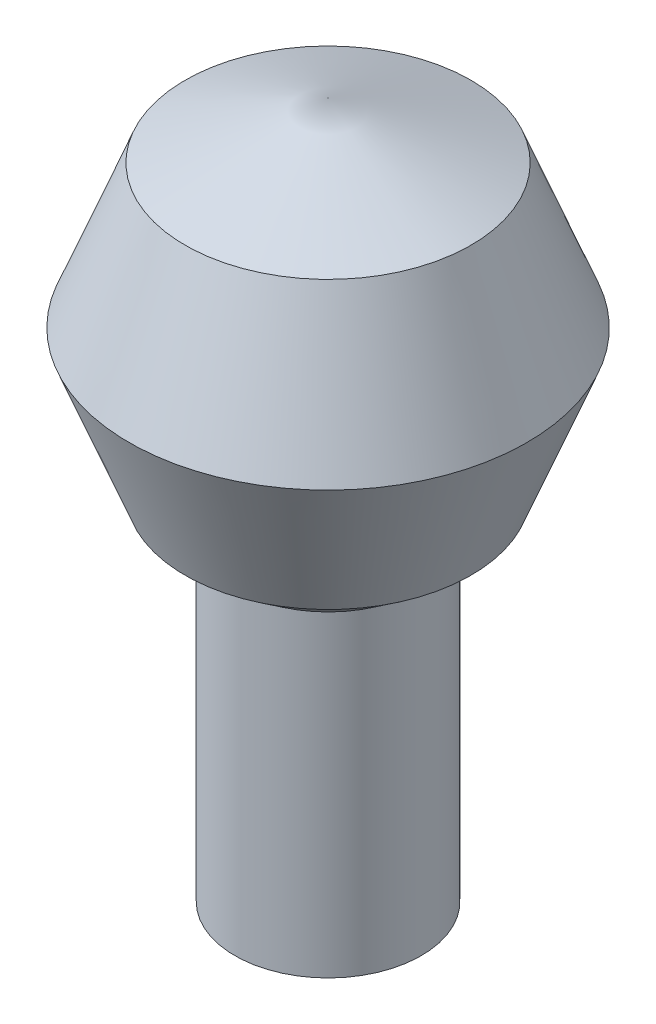
ISO-10303-21;
HEADER;
FILE_DESCRIPTION(('STEP AP214'),'2;1');
FILE_NAME('part.step','',(''),(''),'','','');
FILE_SCHEMA(('AUTOMOTIVE_DESIGN { 1 0 10303 214 1 1 1 1 }'));
ENDSEC;
DATA;
#1=APPLICATION_CONTEXT('core data for automotive mechanical design processes');
#2=APPLICATION_PROTOCOL_DEFINITION('international standard','automotive_design',2000,#1);
#3=PRODUCT_CONTEXT('',#1,'mechanical');
#4=PRODUCT('Part','Part','',(#3));
#5=PRODUCT_RELATED_PRODUCT_CATEGORY('part','',(#4));
#6=PRODUCT_DEFINITION_FORMATION('','',#4);
#7=PRODUCT_DEFINITION_CONTEXT('part definition',#1,'design');
#8=PRODUCT_DEFINITION('design','',#6,#7);
#9=PRODUCT_DEFINITION_SHAPE('','',#8);
#10=(LENGTH_UNIT() NAMED_UNIT(*) SI_UNIT(.MILLI.,.METRE.));
#11=(NAMED_UNIT(*) PLANE_ANGLE_UNIT() SI_UNIT($,.RADIAN.));
#12=(NAMED_UNIT(*) SI_UNIT($,.STERADIAN.) SOLID_ANGLE_UNIT());
#13=UNCERTAINTY_MEASURE_WITH_UNIT(LENGTH_MEASURE(1.E-05),#10,'distance_accuracy_value','');
#14=(GEOMETRIC_REPRESENTATION_CONTEXT(3) GLOBAL_UNCERTAINTY_ASSIGNED_CONTEXT((#13)) GLOBAL_UNIT_ASSIGNED_CONTEXT((#10,
#11,#12)) REPRESENTATION_CONTEXT('',''));
#15=CARTESIAN_POINT('',(0.,0.,0.));
#16=DIRECTION('',(0.,0.,1.));
#17=DIRECTION('',(1.,0.,0.));
#18=AXIS2_PLACEMENT_3D('',#15,#16,#17);
#19=CARTESIAN_POINT('',(1.5,-8.,0.));
#20=DIRECTION('',(0.,-1.,0.));
#21=DIRECTION('',(0.,0.,-1.));
#22=AXIS2_PLACEMENT_3D('',#19,#20,#21);
#23=PLANE('',#22);
#24=CARTESIAN_POINT('',(0.,-8.,0.));
#25=DIRECTION('',(0.,-1.,0.));
#26=DIRECTION('',(0.,0.,-1.));
#27=AXIS2_PLACEMENT_3D('',#24,#25,#26);
#28=CIRCLE('',#27,1.5);
#29=CARTESIAN_POINT('',(0.,-8.,-1.5));
#30=VERTEX_POINT('',#29);
#31=EDGE_CURVE('E11',#30,#30,#28,.T.);
#32=ORIENTED_EDGE('',*,*,#31,.T.);
#33=EDGE_LOOP('',(#32));
#34=FACE_BOUND('',#33,.T.);
#35=ADVANCED_FACE('F33',(#34),#23,.T.);
#36=CARTESIAN_POINT('',(0.,-12.,0.));
#37=DIRECTION('',(0.,-1.,0.));
#38=DIRECTION('',(0.,0.,-1.));
#39=AXIS2_PLACEMENT_3D('',#36,#37,#38);
#40=CYLINDRICAL_SURFACE('',#39,1.5);
#41=CARTESIAN_POINT('',(0.,-2.9,0.));
#42=DIRECTION('',(0.,-1.,0.));
#43=DIRECTION('',(0.,0.,-1.));
#44=AXIS2_PLACEMENT_3D('',#41,#42,#43);
#45=CIRCLE('',#44,1.5);
#46=CARTESIAN_POINT('',(0.,-2.9,-1.5));
#47=VERTEX_POINT('',#46);
#48=EDGE_CURVE('E39',#47,#47,#45,.T.);
#49=ORIENTED_EDGE('',*,*,#48,.T.);
#50=EDGE_LOOP('',(#49));
#51=FACE_BOUND('',#50,.T.);
#52=ORIENTED_EDGE('',*,*,#31,.F.);
#53=EDGE_LOOP('',(#52));
#54=FACE_BOUND('',#53,.T.);
#55=ADVANCED_FACE('F61',(#51,#54),#40,.T.);
#56=CARTESIAN_POINT('',(0.,-2.9,0.));
#57=DIRECTION('',(0.,1.,0.));
#58=DIRECTION('',(0.,0.,1.));
#59=AXIS2_PLACEMENT_3D('',#56,#57,#58);
#60=CONICAL_SURFACE('',#59,1.5,0.927295218001612);
#61=CARTESIAN_POINT('',(0.,-2.3,0.));
#62=DIRECTION('',(0.,-1.,0.));
#63=DIRECTION('',(0.,0.,-1.));
#64=AXIS2_PLACEMENT_3D('',#61,#62,#63);
#65=CIRCLE('',#64,2.3);
#66=CARTESIAN_POINT('',(0.,-2.3,-2.3));
#67=VERTEX_POINT('',#66);
#68=EDGE_CURVE('E54',#67,#67,#65,.T.);
#69=ORIENTED_EDGE('',*,*,#68,.T.);
#70=EDGE_LOOP('',(#69));
#71=FACE_BOUND('',#70,.T.);
#72=ORIENTED_EDGE('',*,*,#48,.F.);
#73=EDGE_LOOP('',(#72));
#74=FACE_BOUND('',#73,.T.);
#75=ADVANCED_FACE('F64',(#71,#74),#60,.T.);
#76=CARTESIAN_POINT('',(0.,-2.3,0.));
#77=DIRECTION('',(0.,1.,0.));
#78=DIRECTION('',(0.,0.,1.));
#79=AXIS2_PLACEMENT_3D('',#76,#77,#78);
#80=CONICAL_SURFACE('',#79,2.3,0.372987721800061);
#81=CARTESIAN_POINT('',(0.,0.,0.));
#82=DIRECTION('',(0.,-1.,0.));
#83=DIRECTION('',(0.,0.,-1.));
#84=AXIS2_PLACEMENT_3D('',#81,#82,#83);
#85=CIRCLE('',#84,3.2);
#86=CARTESIAN_POINT('',(0.,0.,-3.2));
#87=VERTEX_POINT('',#86);
#88=EDGE_CURVE('E51',#87,#87,#85,.T.);
#89=ORIENTED_EDGE('',*,*,#88,.T.);
#90=EDGE_LOOP('',(#89));
#91=FACE_BOUND('',#90,.T.);
#92=ORIENTED_EDGE('',*,*,#68,.F.);
#93=EDGE_LOOP('',(#92));
#94=FACE_BOUND('',#93,.T.);
#95=ADVANCED_FACE('F66',(#91,#94),#80,.T.);
#96=CARTESIAN_POINT('',(0.,0.,0.));
#97=DIRECTION('',(0.,-1.,0.));
#98=DIRECTION('',(0.,0.,-1.));
#99=AXIS2_PLACEMENT_3D('',#96,#97,#98);
#100=CONICAL_SURFACE('',#99,3.2,0.372987721800061);
#101=CARTESIAN_POINT('',(0.,2.3,0.));
#102=DIRECTION('',(0.,-1.,0.));
#103=DIRECTION('',(0.,0.,-1.));
#104=AXIS2_PLACEMENT_3D('',#101,#102,#103);
#105=CIRCLE('',#104,2.3);
#106=CARTESIAN_POINT('',(0.,2.3,-2.3));
#107=VERTEX_POINT('',#106);
#108=EDGE_CURVE('E49',#107,#107,#105,.T.);
#109=ORIENTED_EDGE('',*,*,#108,.T.);
#110=EDGE_LOOP('',(#109));
#111=FACE_BOUND('',#110,.T.);
#112=ORIENTED_EDGE('',*,*,#88,.F.);
#113=EDGE_LOOP('',(#112));
#114=FACE_BOUND('',#113,.T.);
#115=ADVANCED_FACE('F45',(#111,#114),#100,.T.);
#116=CARTESIAN_POINT('',(0.,2.3,0.));
#117=DIRECTION('',(0.,-1.,0.));
#118=DIRECTION('',(0.,0.,-1.));
#119=AXIS2_PLACEMENT_3D('',#116,#117,#118);
#120=CONICAL_SURFACE('',#119,2.3,1.19780860499484);
#121=CARTESIAN_POINT('',(0.,3.2,0.));
#122=VERTEX_POINT('',#121);
#123=VERTEX_LOOP('',#122);
#124=FACE_BOUND('',#123,.T.);
#125=ORIENTED_EDGE('',*,*,#108,.F.);
#126=EDGE_LOOP('',(#125));
#127=FACE_BOUND('',#126,.T.);
#128=ADVANCED_FACE('F42',(#124,#127),#120,.T.);
#129=CLOSED_SHELL('',(#35,#55,#75,#95,#115,#128));
#130=MANIFOLD_SOLID_BREP('B2',#129);
#131=ADVANCED_BREP_SHAPE_REPRESENTATION('',(#18,#130),#14);
#132=SHAPE_DEFINITION_REPRESENTATION(#9,#131);
ENDSEC;
END-ISO-10303-21;
